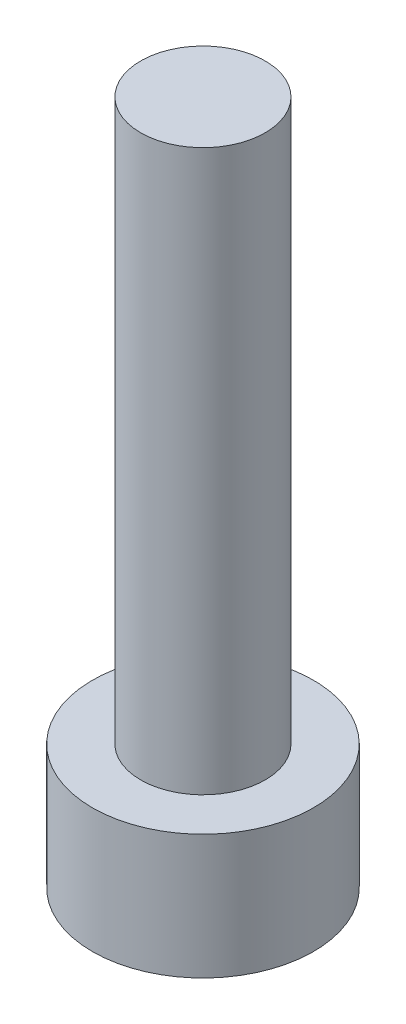
ISO-10303-21;
HEADER;
FILE_DESCRIPTION(('STEP AP214'),'2;1');
FILE_NAME('part.step','',(''),(''),'','','');
FILE_SCHEMA(('AUTOMOTIVE_DESIGN { 1 0 10303 214 1 1 1 1 }'));
ENDSEC;
DATA;
#1=APPLICATION_CONTEXT('core data for automotive mechanical design processes');
#2=APPLICATION_PROTOCOL_DEFINITION('international standard','automotive_design',2000,#1);
#3=PRODUCT_CONTEXT('',#1,'mechanical');
#4=PRODUCT('Part','Part','',(#3));
#5=PRODUCT_RELATED_PRODUCT_CATEGORY('part','',(#4));
#6=PRODUCT_DEFINITION_FORMATION('','',#4);
#7=PRODUCT_DEFINITION_CONTEXT('part definition',#1,'design');
#8=PRODUCT_DEFINITION('design','',#6,#7);
#9=PRODUCT_DEFINITION_SHAPE('','',#8);
#10=(LENGTH_UNIT() NAMED_UNIT(*) SI_UNIT(.MILLI.,.METRE.));
#11=(NAMED_UNIT(*) PLANE_ANGLE_UNIT() SI_UNIT($,.RADIAN.));
#12=(NAMED_UNIT(*) SI_UNIT($,.STERADIAN.) SOLID_ANGLE_UNIT());
#13=UNCERTAINTY_MEASURE_WITH_UNIT(LENGTH_MEASURE(1.E-05),#10,'distance_accuracy_value','');
#14=(GEOMETRIC_REPRESENTATION_CONTEXT(3) GLOBAL_UNCERTAINTY_ASSIGNED_CONTEXT((#13)) GLOBAL_UNIT_ASSIGNED_CONTEXT((#10,
#11,#12)) REPRESENTATION_CONTEXT('',''));
#15=CARTESIAN_POINT('',(0.,0.,0.));
#16=DIRECTION('',(0.,0.,1.));
#17=DIRECTION('',(1.,0.,0.));
#18=AXIS2_PLACEMENT_3D('',#15,#16,#17);
#19=CARTESIAN_POINT('',(0.,4.,0.));
#20=DIRECTION('',(0.,-1.,0.));
#21=DIRECTION('',(0.,0.,-1.));
#22=AXIS2_PLACEMENT_3D('',#19,#20,#21);
#23=CYLINDRICAL_SURFACE('',#22,3.55);
#24=CARTESIAN_POINT('',(0.,4.,0.));
#25=DIRECTION('',(0.,1.,0.));
#26=DIRECTION('',(0.,0.,1.));
#27=AXIS2_PLACEMENT_3D('',#24,#25,#26);
#28=CIRCLE('',#27,3.55);
#29=CARTESIAN_POINT('',(0.,4.,3.55));
#30=VERTEX_POINT('',#29);
#31=EDGE_CURVE('E47',#30,#30,#28,.T.);
#32=ORIENTED_EDGE('',*,*,#31,.F.);
#33=EDGE_LOOP('',(#32));
#34=FACE_BOUND('',#33,.T.);
#35=CARTESIAN_POINT('',(0.,0.,0.));
#36=DIRECTION('',(0.,1.,0.));
#37=DIRECTION('',(0.,0.,1.));
#38=AXIS2_PLACEMENT_3D('',#35,#36,#37);
#39=CIRCLE('',#38,3.55);
#40=CARTESIAN_POINT('',(0.,0.,3.55));
#41=VERTEX_POINT('',#40);
#42=EDGE_CURVE('E42',#41,#41,#39,.T.);
#43=ORIENTED_EDGE('',*,*,#42,.T.);
#44=EDGE_LOOP('',(#43));
#45=FACE_BOUND('',#44,.T.);
#46=ADVANCED_FACE('F39',(#34,#45),#23,.T.);
#47=CARTESIAN_POINT('',(0.,4.,0.));
#48=DIRECTION('',(0.,1.,0.));
#49=DIRECTION('',(0.,0.,1.));
#50=AXIS2_PLACEMENT_3D('',#47,#48,#49);
#51=PLANE('',#50);
#52=CARTESIAN_POINT('',(0.,4.,0.));
#53=DIRECTION('',(0.,1.,0.));
#54=DIRECTION('',(0.,0.,1.));
#55=AXIS2_PLACEMENT_3D('',#52,#53,#54);
#56=CIRCLE('',#55,2.);
#57=CARTESIAN_POINT('',(0.,4.,2.));
#58=VERTEX_POINT('',#57);
#59=EDGE_CURVE('E10',#58,#58,#56,.T.);
#60=ORIENTED_EDGE('',*,*,#59,.F.);
#61=EDGE_LOOP('',(#60));
#62=FACE_BOUND('',#61,.T.);
#63=ORIENTED_EDGE('',*,*,#31,.T.);
#64=EDGE_LOOP('',(#63));
#65=FACE_BOUND('',#64,.T.);
#66=ADVANCED_FACE('F67',(#62,#65),#51,.T.);
#67=CARTESIAN_POINT('',(0.,0.,0.));
#68=DIRECTION('',(0.,1.,0.));
#69=DIRECTION('',(0.,0.,1.));
#70=AXIS2_PLACEMENT_3D('',#67,#68,#69);
#71=PLANE('',#70);
#72=ORIENTED_EDGE('',*,*,#42,.F.);
#73=EDGE_LOOP('',(#72));
#74=FACE_BOUND('',#73,.T.);
#75=ADVANCED_FACE('F64',(#74),#71,.F.);
#76=CARTESIAN_POINT('',(0.,22.,0.));
#77=DIRECTION('',(0.,-1.,0.));
#78=DIRECTION('',(0.,0.,-1.));
#79=AXIS2_PLACEMENT_3D('',#76,#77,#78);
#80=CYLINDRICAL_SURFACE('',#79,2.);
#81=CARTESIAN_POINT('',(0.,22.,0.));
#82=DIRECTION('',(0.,1.,0.));
#83=DIRECTION('',(0.,0.,1.));
#84=AXIS2_PLACEMENT_3D('',#81,#82,#83);
#85=CIRCLE('',#84,2.);
#86=CARTESIAN_POINT('',(0.,22.,2.));
#87=VERTEX_POINT('',#86);
#88=EDGE_CURVE('E54',#87,#87,#85,.T.);
#89=ORIENTED_EDGE('',*,*,#88,.F.);
#90=EDGE_LOOP('',(#89));
#91=FACE_BOUND('',#90,.T.);
#92=ORIENTED_EDGE('',*,*,#59,.T.);
#93=EDGE_LOOP('',(#92));
#94=FACE_BOUND('',#93,.T.);
#95=ADVANCED_FACE('F66',(#91,#94),#80,.T.);
#96=CARTESIAN_POINT('',(0.,22.,0.));
#97=DIRECTION('',(0.,1.,0.));
#98=DIRECTION('',(0.,0.,1.));
#99=AXIS2_PLACEMENT_3D('',#96,#97,#98);
#100=PLANE('',#99);
#101=ORIENTED_EDGE('',*,*,#88,.T.);
#102=EDGE_LOOP('',(#101));
#103=FACE_BOUND('',#102,.T.);
#104=ADVANCED_FACE('F72',(#103),#100,.T.);
#105=CLOSED_SHELL('',(#46,#66,#75,#95,#104));
#106=MANIFOLD_SOLID_BREP('B2',#105);
#107=ADVANCED_BREP_SHAPE_REPRESENTATION('',(#18,#106),#14);
#108=SHAPE_DEFINITION_REPRESENTATION(#9,#107);
ENDSEC;
END-ISO-10303-21;
